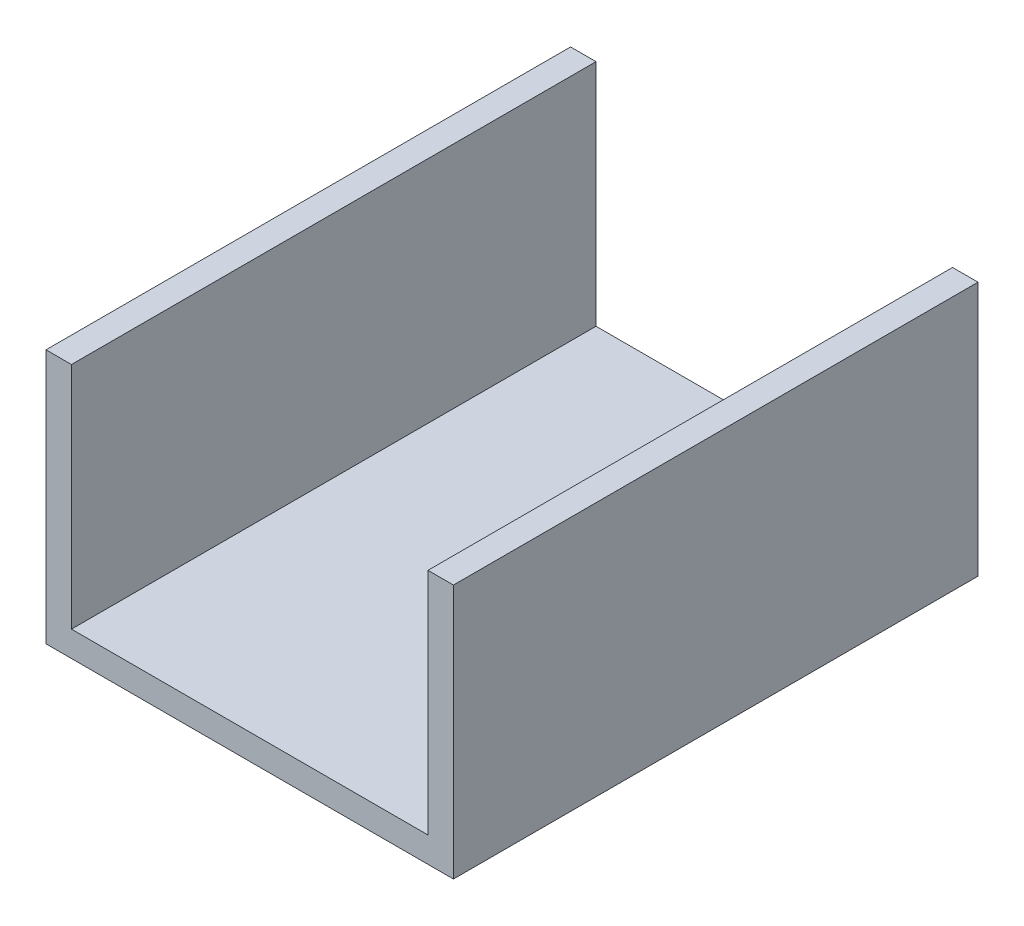
ISO-10303-21;
HEADER;
FILE_DESCRIPTION(('STEP AP214'),'2;1');
FILE_NAME('part.step','',(''),(''),'','','');
FILE_SCHEMA(('AUTOMOTIVE_DESIGN { 1 0 10303 214 1 1 1 1 }'));
ENDSEC;
DATA;
#1=APPLICATION_CONTEXT('core data for automotive mechanical design processes');
#2=APPLICATION_PROTOCOL_DEFINITION('international standard','automotive_design',2000,#1);
#3=PRODUCT_CONTEXT('',#1,'mechanical');
#4=PRODUCT('Part','Part','',(#3));
#5=PRODUCT_RELATED_PRODUCT_CATEGORY('part','',(#4));
#6=PRODUCT_DEFINITION_FORMATION('','',#4);
#7=PRODUCT_DEFINITION_CONTEXT('part definition',#1,'design');
#8=PRODUCT_DEFINITION('design','',#6,#7);
#9=PRODUCT_DEFINITION_SHAPE('','',#8);
#10=(LENGTH_UNIT() NAMED_UNIT(*) SI_UNIT(.MILLI.,.METRE.));
#11=(NAMED_UNIT(*) PLANE_ANGLE_UNIT() SI_UNIT($,.RADIAN.));
#12=(NAMED_UNIT(*) SI_UNIT($,.STERADIAN.) SOLID_ANGLE_UNIT());
#13=UNCERTAINTY_MEASURE_WITH_UNIT(LENGTH_MEASURE(1.E-05),#10,'distance_accuracy_value','');
#14=(GEOMETRIC_REPRESENTATION_CONTEXT(3) GLOBAL_UNCERTAINTY_ASSIGNED_CONTEXT((#13)) GLOBAL_UNIT_ASSIGNED_CONTEXT((#10,
#11,#12)) REPRESENTATION_CONTEXT('',''));
#15=CARTESIAN_POINT('',(0.,0.,0.));
#16=DIRECTION('',(0.,0.,1.));
#17=DIRECTION('',(1.,0.,0.));
#18=AXIS2_PLACEMENT_3D('',#15,#16,#17);
#19=CARTESIAN_POINT('',(0.,0.,103.));
#20=DIRECTION('',(1.,0.,0.));
#21=DIRECTION('',(0.,0.,-1.));
#22=AXIS2_PLACEMENT_3D('',#19,#20,#21);
#23=PLANE('',#22);
#24=DIRECTION('',(0.,-1.,0.));
#25=VECTOR('',#24,1.);
#26=CARTESIAN_POINT('',(0.,0.,0.));
#27=LINE('',#26,#25);
#28=CARTESIAN_POINT('',(0.,50.,0.));
#29=VERTEX_POINT('',#28);
#30=CARTESIAN_POINT('',(0.,0.,0.));
#31=VERTEX_POINT('',#30);
#32=EDGE_CURVE('E129',#29,#31,#27,.T.);
#33=ORIENTED_EDGE('',*,*,#32,.T.);
#34=DIRECTION('',(0.,0.,-1.));
#35=VECTOR('',#34,1.);
#36=CARTESIAN_POINT('',(0.,0.,103.));
#37=LINE('',#36,#35);
#38=CARTESIAN_POINT('',(0.,0.,103.));
#39=VERTEX_POINT('',#38);
#40=EDGE_CURVE('E11',#39,#31,#37,.T.);
#41=ORIENTED_EDGE('',*,*,#40,.F.);
#42=DIRECTION('',(0.,-1.,0.));
#43=VECTOR('',#42,1.);
#44=CARTESIAN_POINT('',(0.,0.,103.));
#45=LINE('',#44,#43);
#46=CARTESIAN_POINT('',(0.,50.,103.));
#47=VERTEX_POINT('',#46);
#48=EDGE_CURVE('E143',#47,#39,#45,.T.);
#49=ORIENTED_EDGE('',*,*,#48,.F.);
#50=DIRECTION('',(0.,0.,-1.));
#51=VECTOR('',#50,1.);
#52=CARTESIAN_POINT('',(0.,50.,103.));
#53=LINE('',#52,#51);
#54=EDGE_CURVE('E125',#47,#29,#53,.T.);
#55=ORIENTED_EDGE('',*,*,#54,.T.);
#56=EDGE_LOOP('',(#33,#41,#49,#55));
#57=FACE_BOUND('',#56,.T.);
#58=ADVANCED_FACE('F33',(#57),#23,.F.);
#59=CARTESIAN_POINT('',(0.,0.,103.));
#60=DIRECTION('',(0.,1.,0.));
#61=DIRECTION('',(0.,0.,1.));
#62=AXIS2_PLACEMENT_3D('',#59,#60,#61);
#63=PLANE('',#62);
#64=DIRECTION('',(1.,0.,0.));
#65=VECTOR('',#64,1.);
#66=CARTESIAN_POINT('',(0.,0.,0.));
#67=LINE('',#66,#65);
#68=CARTESIAN_POINT('',(80.,0.,0.));
#69=VERTEX_POINT('',#68);
#70=EDGE_CURVE('E132',#31,#69,#67,.T.);
#71=ORIENTED_EDGE('',*,*,#70,.T.);
#72=DIRECTION('',(0.,0.,-1.));
#73=VECTOR('',#72,1.);
#74=CARTESIAN_POINT('',(80.,0.,103.));
#75=LINE('',#74,#73);
#76=CARTESIAN_POINT('',(80.,0.,103.));
#77=VERTEX_POINT('',#76);
#78=EDGE_CURVE('E41',#77,#69,#75,.T.);
#79=ORIENTED_EDGE('',*,*,#78,.F.);
#80=DIRECTION('',(1.,0.,0.));
#81=VECTOR('',#80,1.);
#82=CARTESIAN_POINT('',(0.,0.,103.));
#83=LINE('',#82,#81);
#84=EDGE_CURVE('E92',#39,#77,#83,.T.);
#85=ORIENTED_EDGE('',*,*,#84,.F.);
#86=ORIENTED_EDGE('',*,*,#40,.T.);
#87=EDGE_LOOP('',(#71,#79,#85,#86));
#88=FACE_BOUND('',#87,.T.);
#89=ADVANCED_FACE('F178',(#88),#63,.F.);
#90=CARTESIAN_POINT('',(80.,0.,103.));
#91=DIRECTION('',(-1.,0.,0.));
#92=DIRECTION('',(0.,0.,1.));
#93=AXIS2_PLACEMENT_3D('',#90,#91,#92);
#94=PLANE('',#93);
#95=DIRECTION('',(0.,1.,0.));
#96=VECTOR('',#95,1.);
#97=CARTESIAN_POINT('',(80.,0.,0.));
#98=LINE('',#97,#96);
#99=CARTESIAN_POINT('',(80.,50.,0.));
#100=VERTEX_POINT('',#99);
#101=EDGE_CURVE('E134',#69,#100,#98,.T.);
#102=ORIENTED_EDGE('',*,*,#101,.T.);
#103=DIRECTION('',(0.,0.,-1.));
#104=VECTOR('',#103,1.);
#105=CARTESIAN_POINT('',(80.,50.,103.));
#106=LINE('',#105,#104);
#107=CARTESIAN_POINT('',(80.,50.,103.));
#108=VERTEX_POINT('',#107);
#109=EDGE_CURVE('E150',#108,#100,#106,.T.);
#110=ORIENTED_EDGE('',*,*,#109,.F.);
#111=DIRECTION('',(0.,1.,0.));
#112=VECTOR('',#111,1.);
#113=CARTESIAN_POINT('',(80.,0.,103.));
#114=LINE('',#113,#112);
#115=EDGE_CURVE('E158',#77,#108,#114,.T.);
#116=ORIENTED_EDGE('',*,*,#115,.F.);
#117=ORIENTED_EDGE('',*,*,#78,.T.);
#118=EDGE_LOOP('',(#102,#110,#116,#117));
#119=FACE_BOUND('',#118,.T.);
#120=ADVANCED_FACE('F156',(#119),#94,.F.);
#121=CARTESIAN_POINT('',(80.,50.,103.));
#122=DIRECTION('',(0.,-1.,0.));
#123=DIRECTION('',(0.,0.,-1.));
#124=AXIS2_PLACEMENT_3D('',#121,#122,#123);
#125=PLANE('',#124);
#126=DIRECTION('',(-1.,0.,0.));
#127=VECTOR('',#126,1.);
#128=CARTESIAN_POINT('',(80.,50.,0.));
#129=LINE('',#128,#127);
#130=CARTESIAN_POINT('',(75.,50.,0.));
#131=VERTEX_POINT('',#130);
#132=EDGE_CURVE('E136',#100,#131,#129,.T.);
#133=ORIENTED_EDGE('',*,*,#132,.T.);
#134=DIRECTION('',(0.,0.,-1.));
#135=VECTOR('',#134,1.);
#136=CARTESIAN_POINT('',(75.,50.,103.));
#137=LINE('',#136,#135);
#138=CARTESIAN_POINT('',(75.,50.,103.));
#139=VERTEX_POINT('',#138);
#140=EDGE_CURVE('E147',#139,#131,#137,.T.);
#141=ORIENTED_EDGE('',*,*,#140,.F.);
#142=DIRECTION('',(-1.,0.,0.));
#143=VECTOR('',#142,1.);
#144=CARTESIAN_POINT('',(80.,50.,103.));
#145=LINE('',#144,#143);
#146=EDGE_CURVE('E170',#108,#139,#145,.T.);
#147=ORIENTED_EDGE('',*,*,#146,.F.);
#148=ORIENTED_EDGE('',*,*,#109,.T.);
#149=EDGE_LOOP('',(#133,#141,#147,#148));
#150=FACE_BOUND('',#149,.T.);
#151=ADVANCED_FACE('F166',(#150),#125,.F.);
#152=CARTESIAN_POINT('',(75.,50.,103.));
#153=DIRECTION('',(1.,0.,0.));
#154=DIRECTION('',(0.,0.,-1.));
#155=AXIS2_PLACEMENT_3D('',#152,#153,#154);
#156=PLANE('',#155);
#157=DIRECTION('',(0.,-1.,0.));
#158=VECTOR('',#157,1.);
#159=CARTESIAN_POINT('',(75.,50.,0.));
#160=LINE('',#159,#158);
#161=CARTESIAN_POINT('',(75.,5.,0.));
#162=VERTEX_POINT('',#161);
#163=EDGE_CURVE('E138',#131,#162,#160,.T.);
#164=ORIENTED_EDGE('',*,*,#163,.T.);
#165=DIRECTION('',(0.,0.,-1.));
#166=VECTOR('',#165,1.);
#167=CARTESIAN_POINT('',(75.,5.,103.));
#168=LINE('',#167,#166);
#169=CARTESIAN_POINT('',(75.,5.,103.));
#170=VERTEX_POINT('',#169);
#171=EDGE_CURVE('E120',#170,#162,#168,.T.);
#172=ORIENTED_EDGE('',*,*,#171,.F.);
#173=DIRECTION('',(0.,-1.,0.));
#174=VECTOR('',#173,1.);
#175=CARTESIAN_POINT('',(75.,50.,103.));
#176=LINE('',#175,#174);
#177=EDGE_CURVE('E111',#139,#170,#176,.T.);
#178=ORIENTED_EDGE('',*,*,#177,.F.);
#179=ORIENTED_EDGE('',*,*,#140,.T.);
#180=EDGE_LOOP('',(#164,#172,#178,#179));
#181=FACE_BOUND('',#180,.T.);
#182=ADVANCED_FACE('F169',(#181),#156,.F.);
#183=CARTESIAN_POINT('',(5.00000000000001,5.,103.));
#184=DIRECTION('',(0.,-1.,0.));
#185=DIRECTION('',(0.,0.,-1.));
#186=AXIS2_PLACEMENT_3D('',#183,#184,#185);
#187=PLANE('',#186);
#188=DIRECTION('',(-1.,0.,0.));
#189=VECTOR('',#188,1.);
#190=CARTESIAN_POINT('',(5.00000000000001,5.,0.));
#191=LINE('',#190,#189);
#192=CARTESIAN_POINT('',(5.00000000000001,5.,0.));
#193=VERTEX_POINT('',#192);
#194=EDGE_CURVE('E119',#162,#193,#191,.T.);
#195=ORIENTED_EDGE('',*,*,#194,.T.);
#196=DIRECTION('',(0.,0.,-1.));
#197=VECTOR('',#196,1.);
#198=CARTESIAN_POINT('',(5.00000000000001,5.,103.));
#199=LINE('',#198,#197);
#200=CARTESIAN_POINT('',(5.00000000000001,5.,103.));
#201=VERTEX_POINT('',#200);
#202=EDGE_CURVE('E116',#201,#193,#199,.T.);
#203=ORIENTED_EDGE('',*,*,#202,.F.);
#204=DIRECTION('',(-1.,0.,0.));
#205=VECTOR('',#204,1.);
#206=CARTESIAN_POINT('',(5.00000000000001,5.,103.));
#207=LINE('',#206,#205);
#208=EDGE_CURVE('E105',#170,#201,#207,.T.);
#209=ORIENTED_EDGE('',*,*,#208,.F.);
#210=ORIENTED_EDGE('',*,*,#171,.T.);
#211=EDGE_LOOP('',(#195,#203,#209,#210));
#212=FACE_BOUND('',#211,.T.);
#213=ADVANCED_FACE('F117',(#212),#187,.F.);
#214=CARTESIAN_POINT('',(5.,50.,103.));
#215=DIRECTION('',(-1.,0.,0.));
#216=DIRECTION('',(0.,-1.,0.));
#217=AXIS2_PLACEMENT_3D('',#214,#215,#216);
#218=PLANE('',#217);
#219=DIRECTION('',(0.,1.,0.));
#220=VECTOR('',#219,1.);
#221=CARTESIAN_POINT('',(5.,50.,0.));
#222=LINE('',#221,#220);
#223=CARTESIAN_POINT('',(5.,50.,0.));
#224=VERTEX_POINT('',#223);
#225=EDGE_CURVE('E78',#193,#224,#222,.T.);
#226=ORIENTED_EDGE('',*,*,#225,.T.);
#227=DIRECTION('',(0.,0.,-1.));
#228=VECTOR('',#227,1.);
#229=CARTESIAN_POINT('',(5.,50.,103.));
#230=LINE('',#229,#228);
#231=CARTESIAN_POINT('',(5.,50.,103.));
#232=VERTEX_POINT('',#231);
#233=EDGE_CURVE('E121',#232,#224,#230,.T.);
#234=ORIENTED_EDGE('',*,*,#233,.F.);
#235=DIRECTION('',(0.,1.,0.));
#236=VECTOR('',#235,1.);
#237=CARTESIAN_POINT('',(5.,50.,103.));
#238=LINE('',#237,#236);
#239=EDGE_CURVE('E109',#201,#232,#238,.T.);
#240=ORIENTED_EDGE('',*,*,#239,.F.);
#241=ORIENTED_EDGE('',*,*,#202,.T.);
#242=EDGE_LOOP('',(#226,#234,#240,#241));
#243=FACE_BOUND('',#242,.T.);
#244=ADVANCED_FACE('F123',(#243),#218,.F.);
#245=CARTESIAN_POINT('',(0.,50.,103.));
#246=DIRECTION('',(0.,-1.,0.));
#247=DIRECTION('',(0.,0.,-1.));
#248=AXIS2_PLACEMENT_3D('',#245,#246,#247);
#249=PLANE('',#248);
#250=DIRECTION('',(-1.,0.,0.));
#251=VECTOR('',#250,1.);
#252=CARTESIAN_POINT('',(0.,50.,0.));
#253=LINE('',#252,#251);
#254=EDGE_CURVE('E84',#224,#29,#253,.T.);
#255=ORIENTED_EDGE('',*,*,#254,.T.);
#256=ORIENTED_EDGE('',*,*,#54,.F.);
#257=DIRECTION('',(-1.,0.,0.));
#258=VECTOR('',#257,1.);
#259=CARTESIAN_POINT('',(0.,50.,103.));
#260=LINE('',#259,#258);
#261=EDGE_CURVE('E49',#232,#47,#260,.T.);
#262=ORIENTED_EDGE('',*,*,#261,.F.);
#263=ORIENTED_EDGE('',*,*,#233,.T.);
#264=EDGE_LOOP('',(#255,#256,#262,#263));
#265=FACE_BOUND('',#264,.T.);
#266=ADVANCED_FACE('F194',(#265),#249,.F.);
#267=CARTESIAN_POINT('',(0.,0.,103.));
#268=DIRECTION('',(0.,0.,-1.));
#269=DIRECTION('',(-1.,0.,0.));
#270=AXIS2_PLACEMENT_3D('',#267,#268,#269);
#271=PLANE('',#270);
#272=ORIENTED_EDGE('',*,*,#48,.T.);
#273=ORIENTED_EDGE('',*,*,#84,.T.);
#274=ORIENTED_EDGE('',*,*,#115,.T.);
#275=ORIENTED_EDGE('',*,*,#146,.T.);
#276=ORIENTED_EDGE('',*,*,#177,.T.);
#277=ORIENTED_EDGE('',*,*,#208,.T.);
#278=ORIENTED_EDGE('',*,*,#239,.T.);
#279=ORIENTED_EDGE('',*,*,#261,.T.);
#280=EDGE_LOOP('',(#272,#273,#274,#275,#276,#277,#278,#279));
#281=FACE_BOUND('',#280,.T.);
#282=ADVANCED_FACE('F107',(#281),#271,.F.);
#283=CARTESIAN_POINT('',(0.,0.,0.));
#284=DIRECTION('',(0.,0.,-1.));
#285=DIRECTION('',(-1.,0.,0.));
#286=AXIS2_PLACEMENT_3D('',#283,#284,#285);
#287=PLANE('',#286);
#288=ORIENTED_EDGE('',*,*,#32,.F.);
#289=ORIENTED_EDGE('',*,*,#254,.F.);
#290=ORIENTED_EDGE('',*,*,#225,.F.);
#291=ORIENTED_EDGE('',*,*,#194,.F.);
#292=ORIENTED_EDGE('',*,*,#163,.F.);
#293=ORIENTED_EDGE('',*,*,#132,.F.);
#294=ORIENTED_EDGE('',*,*,#101,.F.);
#295=ORIENTED_EDGE('',*,*,#70,.F.);
#296=EDGE_LOOP('',(#288,#289,#290,#291,#292,#293,#294,#295));
#297=FACE_BOUND('',#296,.T.);
#298=ADVANCED_FACE('F162',(#297),#287,.T.);
#299=CLOSED_SHELL('',(#58,#89,#120,#151,#182,#213,#244,#266,#282,#298));
#300=MANIFOLD_SOLID_BREP('B2',#299);
#301=ADVANCED_BREP_SHAPE_REPRESENTATION('',(#18,#300),#14);
#302=SHAPE_DEFINITION_REPRESENTATION(#9,#301);
ENDSEC;
END-ISO-10303-21;
